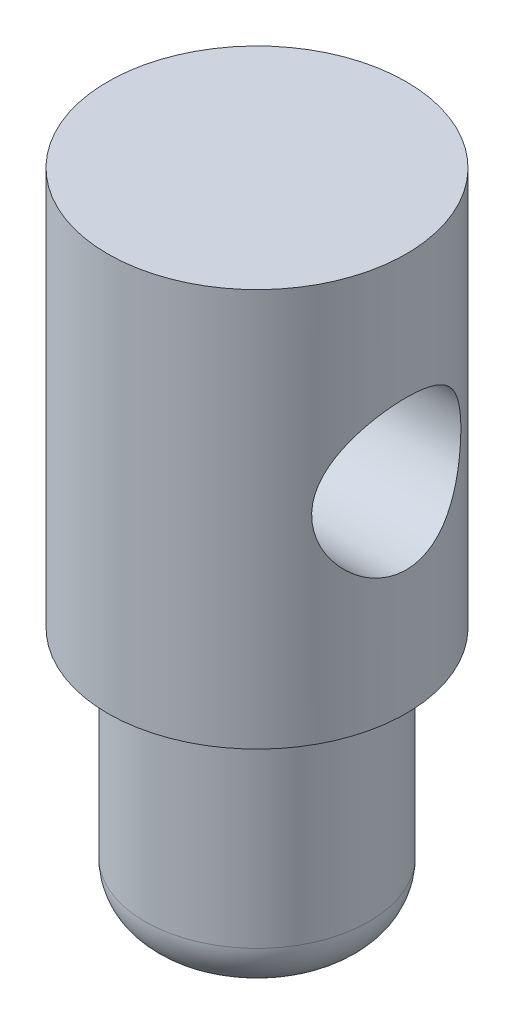
ISO-10303-21;
HEADER;
FILE_DESCRIPTION(('STEP AP214'),'2;1');
FILE_NAME('part.step','',(''),(''),'','','');
FILE_SCHEMA(('AUTOMOTIVE_DESIGN { 1 0 10303 214 1 1 1 1 }'));
ENDSEC;
DATA;
#1=APPLICATION_CONTEXT('core data for automotive mechanical design processes');
#2=APPLICATION_PROTOCOL_DEFINITION('international standard','automotive_design',2000,#1);
#3=PRODUCT_CONTEXT('',#1,'mechanical');
#4=PRODUCT('Part','Part','',(#3));
#5=PRODUCT_RELATED_PRODUCT_CATEGORY('part','',(#4));
#6=PRODUCT_DEFINITION_FORMATION('','',#4);
#7=PRODUCT_DEFINITION_CONTEXT('part definition',#1,'design');
#8=PRODUCT_DEFINITION('design','',#6,#7);
#9=PRODUCT_DEFINITION_SHAPE('','',#8);
#10=(LENGTH_UNIT() NAMED_UNIT(*) SI_UNIT(.MILLI.,.METRE.));
#11=(NAMED_UNIT(*) PLANE_ANGLE_UNIT() SI_UNIT($,.RADIAN.));
#12=(NAMED_UNIT(*) SI_UNIT($,.STERADIAN.) SOLID_ANGLE_UNIT());
#13=UNCERTAINTY_MEASURE_WITH_UNIT(LENGTH_MEASURE(1.E-05),#10,'distance_accuracy_value','');
#14=(GEOMETRIC_REPRESENTATION_CONTEXT(3) GLOBAL_UNCERTAINTY_ASSIGNED_CONTEXT((#13)) GLOBAL_UNIT_ASSIGNED_CONTEXT((#10,
#11,#12)) REPRESENTATION_CONTEXT('',''));
#15=CARTESIAN_POINT('',(0.,0.,0.));
#16=DIRECTION('',(0.,0.,1.));
#17=DIRECTION('',(1.,0.,0.));
#18=AXIS2_PLACEMENT_3D('',#15,#16,#17);
#19=CARTESIAN_POINT('',(0.,8.,0.));
#20=DIRECTION('',(0.,1.,0.));
#21=DIRECTION('',(0.,0.,1.));
#22=AXIS2_PLACEMENT_3D('',#19,#20,#21);
#23=PLANE('',#22);
#24=CARTESIAN_POINT('',(0.,8.,0.));
#25=DIRECTION('',(0.,1.,0.));
#26=DIRECTION('',(0.,0.,1.));
#27=AXIS2_PLACEMENT_3D('',#24,#25,#26);
#28=CIRCLE('',#27,3.);
#29=CARTESIAN_POINT('',(0.,8.,3.));
#30=VERTEX_POINT('',#29);
#31=EDGE_CURVE('E91',#30,#30,#28,.T.);
#32=ORIENTED_EDGE('',*,*,#31,.T.);
#33=EDGE_LOOP('',(#32));
#34=FACE_BOUND('',#33,.T.);
#35=ADVANCED_FACE('F35',(#34),#23,.T.);
#36=CARTESIAN_POINT('',(0.,2.,0.));
#37=DIRECTION('',(0.,-1.,0.));
#38=DIRECTION('',(0.,0.,-1.));
#39=AXIS2_PLACEMENT_3D('',#36,#37,#38);
#40=CYLINDRICAL_SURFACE('',#39,3.);
#41=CARTESIAN_POINT('',(-3.,2.5,0.));
#42=CARTESIAN_POINT('',(-2.99999570107562,2.50000495347579,-0.0788579444268502));
#43=CARTESIAN_POINT('',(-2.99685736529635,2.50625510968158,-0.157809899546344));
#44=CARTESIAN_POINT('',(-2.98461234055736,2.53097932051231,-0.313380352903344));
#45=CARTESIAN_POINT('',(-2.97549431743379,2.54947658949672,-0.389994130070444));
#46=CARTESIAN_POINT('',(-2.95224419105063,2.59779071292494,-0.538400317320673));
#47=CARTESIAN_POINT('',(-2.93813158766306,2.62756357637195,-0.61021020440872));
#48=CARTESIAN_POINT('',(-2.90618664773642,2.69735593204748,-0.747708925209898));
#49=CARTESIAN_POINT('',(-2.88835460450288,2.7373746163733,-0.813398240985089));
#50=CARTESIAN_POINT('',(-2.84934387387093,2.82927587422793,-0.941261726642864));
#51=CARTESIAN_POINT('',(-2.82802798691306,2.88172971885946,-1.00298281668316));
#52=CARTESIAN_POINT('',(-2.78489955370115,2.99578221887055,-1.11716916730047));
#53=CARTESIAN_POINT('',(-2.76308664313552,3.05738777765866,-1.16962737466015));
#54=CARTESIAN_POINT('',(-2.71948426796021,3.19372502428507,-1.26787800067542));
#55=CARTESIAN_POINT('',(-2.69782780455198,3.26910414751887,-1.31283800332746));
#56=CARTESIAN_POINT('',(-2.65928968158481,3.42755100397932,-1.38925234033604));
#57=CARTESIAN_POINT('',(-2.64240461410484,3.51061319308412,-1.4207163224495));
#58=CARTESIAN_POINT('',(-2.61686800556713,3.67699765813288,-1.46719866328288));
#59=CARTESIAN_POINT('',(-2.6077840737557,3.76000667810109,-1.48308878562066));
#60=CARTESIAN_POINT('',(-2.59772834922792,3.92796825666922,-1.50064048996327));
#61=CARTESIAN_POINT('',(-2.59674854014932,4.01291881130673,-1.50231613255961));
#62=CARTESIAN_POINT('',(-2.60266395385873,4.17142903647305,-1.49203093075844));
#63=CARTESIAN_POINT('',(-2.6086314549302,4.24513604683457,-1.48167683930523));
#64=CARTESIAN_POINT('',(-2.62614343100775,4.38958286405956,-1.4504097735854));
#65=CARTESIAN_POINT('',(-2.63768968247664,4.46032171795797,-1.42949343584648));
#66=CARTESIAN_POINT('',(-2.66531214619112,4.59884369884849,-1.37731467057901));
#67=CARTESIAN_POINT('',(-2.68148760995998,4.66651959817868,-1.34582260067399));
#68=CARTESIAN_POINT('',(-2.71655106422106,4.79595143888501,-1.273562531502));
#69=CARTESIAN_POINT('',(-2.73544027170286,4.85770470340013,-1.2327903657187));
#70=CARTESIAN_POINT('',(-2.77669736854929,4.98178187911484,-1.13709908236918));
#71=CARTESIAN_POINT('',(-2.79920265355119,5.04318531036424,-1.08104168755392));
#72=CARTESIAN_POINT('',(-2.84321434950611,5.15610312788635,-0.95933336811206));
#73=CARTESIAN_POINT('',(-2.86472027938201,5.20761278805083,-0.893677884861428));
#74=CARTESIAN_POINT('',(-2.90552980924446,5.30152849154459,-0.750774758747772));
#75=CARTESIAN_POINT('',(-2.92468476243011,5.34340070866861,-0.673130387399113));
#76=CARTESIAN_POINT('',(-2.95736821681863,5.41314554356452,-0.510699323233194));
#77=CARTESIAN_POINT('',(-2.9709011841533,5.44102927752275,-0.425918364397913));
#78=CARTESIAN_POINT('',(-2.98986500612153,5.47971310557501,-0.259149737491053));
#79=CARTESIAN_POINT('',(-2.99587407451965,5.49173685362017,-0.177512295822489));
#80=CARTESIAN_POINT('',(-3.00109520188655,5.50219709670173,-0.0131693999240275));
#81=CARTESIAN_POINT('',(-3.00031048081978,5.5006400284592,0.0695355298048631));
#82=CARTESIAN_POINT('',(-2.99236788380152,5.48468996737189,0.22684945797898));
#83=CARTESIAN_POINT('',(-2.98570868532252,5.47130120090501,0.301589112074895));
#84=CARTESIAN_POINT('',(-2.9673325697226,5.43364289215732,0.447610338452912));
#85=CARTESIAN_POINT('',(-2.95561509501618,5.40937215031976,0.518891528536631));
#86=CARTESIAN_POINT('',(-2.92776377120382,5.35000230035045,0.65833291267436));
#87=CARTESIAN_POINT('',(-2.91151322654446,5.31461342482557,0.726345595508705));
#88=CARTESIAN_POINT('',(-2.87615961476126,5.23433869653015,0.855692042548908));
#89=CARTESIAN_POINT('',(-2.85705533350407,5.18944879810691,0.917022944664888));
#90=CARTESIAN_POINT('',(-2.81562332004297,5.08635936200393,1.03765153393382));
#91=CARTESIAN_POINT('',(-2.79316327265249,5.02728569733228,1.09615811672854));
#92=CARTESIAN_POINT('',(-2.7489358741323,4.90011227308341,1.20278448167828));
#93=CARTESIAN_POINT('',(-2.72716901100071,4.83200632172812,1.25089707856781));
#94=CARTESIAN_POINT('',(-2.68576788309734,4.68453451874054,1.33756187171853));
#95=CARTESIAN_POINT('',(-2.66628794383591,4.60478310085828,1.37553824370037));
#96=CARTESIAN_POINT('',(-2.63361108441202,4.43873489863755,1.43712423890206));
#97=CARTESIAN_POINT('',(-2.62040607332625,4.35244671029966,1.46075237380053));
#98=CARTESIAN_POINT('',(-2.60342251538703,4.18463466567294,1.49079253120031));
#99=CARTESIAN_POINT('',(-2.59886075197597,4.10344861984714,1.49863949460818));
#100=CARTESIAN_POINT('',(-2.59748031962405,3.94082939925321,1.5010337315643));
#101=CARTESIAN_POINT('',(-2.60065829439585,3.85939634689321,1.49558676993486));
#102=CARTESIAN_POINT('',(-2.61356793076615,3.70677474769984,1.47288918838996));
#103=CARTESIAN_POINT('',(-2.62264641723988,3.63534929478289,1.45681247151455));
#104=CARTESIAN_POINT('',(-2.64556524281479,3.49628782086345,1.41476303733662));
#105=CARTESIAN_POINT('',(-2.65940711354503,3.42865302686195,1.38878713673988));
#106=CARTESIAN_POINT('',(-2.69142795546803,3.2940627235202,1.32572361795085));
#107=CARTESIAN_POINT('',(-2.70983583593881,3.22745814725646,1.28800670672355));
#108=CARTESIAN_POINT('',(-2.74852997452291,3.10108819572811,1.20322645745609));
#109=CARTESIAN_POINT('',(-2.76881720693416,3.04132640421833,1.15615825686234));
#110=CARTESIAN_POINT('',(-2.81193484737138,2.92278702646799,1.04730498999206));
#111=CARTESIAN_POINT('',(-2.83477474959942,2.86501134647456,0.984426634495893));
#112=CARTESIAN_POINT('',(-2.87816628389896,2.7606055248471,0.849232209349797));
#113=CARTESIAN_POINT('',(-2.89871667939293,2.71398139079514,0.776911084957797));
#114=CARTESIAN_POINT('',(-2.93547014349806,2.63314545593189,0.623897395174419));
#115=CARTESIAN_POINT('',(-2.95164144740899,2.5990237461453,0.543149255665096));
#116=CARTESIAN_POINT('',(-2.9775201194848,2.54528774836389,0.37611315170713));
#117=CARTESIAN_POINT('',(-2.98724585044602,2.52563222979143,0.28984169938365));
#118=CARTESIAN_POINT('',(-2.99543192870217,2.50915388337139,0.168902919736343));
#119=CARTESIAN_POINT('',(-2.99714048010376,2.50572603870049,0.135242819162348));
#120=CARTESIAN_POINT('',(-2.99942545465223,2.50114800172887,0.0677275977076379));
#121=CARTESIAN_POINT('',(-3.00000184655071,2.49999787229469,0.0338724714699429));
#122=CARTESIAN_POINT('',(-3.,2.5,0.));
#123=B_SPLINE_CURVE_WITH_KNOTS('',3,(#41,#42,#43,#44,#45,#46,#47,#48,#49,#50,#51,#52,#53,#54,
#55,#56,#57,#58,#59,#60,#61,#62,#63,#64,#65,#66,#67,#68,#69,#70,#71,#72,#73,#74,#75,#76,#77,#78,
#79,#80,#81,#82,#83,#84,#85,#86,#87,#88,#89,#90,#91,#92,#93,#94,#95,#96,#97,#98,#99,#100,#101,
#102,#103,#104,#105,#106,#107,#108,#109,#110,#111,#112,#113,#114,#115,#116,#117,#118,#119,#120,
#121,#122),.UNSPECIFIED.,.T.,.F.,(4,2,2,2,2,2,2,2,2,2,2,2,2,2,2,2,2,2,2,2,2,2,2,2,2,2,2,2,2,2,2,
2,2,2,2,2,2,2,2,2,4),(0.,0.236436386130439,0.473322224563797,0.709293233238448,
0.945245640872352,1.19547263807713,1.44588935648105,1.71572589646129,1.98536921847421,
2.23887018210344,2.49212035993531,2.71508568613981,2.93812205888518,3.16635360252731,
3.39468781890333,3.65197412000818,3.9093830189803,4.17874533321661,4.4478932536842,
4.69474935707019,4.94148846767214,5.16910359759183,5.39674382446398,5.63089284041848,
5.86514176122509,6.12239415966628,6.37982382923148,6.64972023242589,6.91926767918177,
7.1629396125457,7.40650589797018,7.62686895373284,7.84730293182527,8.08254685170431,
8.31791341715446,8.58187864135758,8.84598575071869,9.11196020495291,9.37717362931724,
9.47872920200876,9.580287577666),.UNSPECIFIED.);
#124=CARTESIAN_POINT('',(-3.,2.5,0.));
#125=VERTEX_POINT('',#124);
#126=EDGE_CURVE('E46',#125,#125,#123,.T.);
#127=ORIENTED_EDGE('',*,*,#126,.T.);
#128=EDGE_LOOP('',(#127));
#129=FACE_BOUND('',#128,.T.);
#130=CARTESIAN_POINT('',(2.59807621135332,4.,-1.5));
#131=CARTESIAN_POINT('',(2.59808302092689,3.92183828770712,-1.4999945446118));
#132=CARTESIAN_POINT('',(2.60165701781635,3.84357788271243,-1.49384995609983));
#133=CARTESIAN_POINT('',(2.61543549678079,3.68945910298427,-1.46958481484708));
#134=CARTESIAN_POINT('',(2.62565391083339,3.61360612743489,-1.45143909683127));
#135=CARTESIAN_POINT('',(2.65124019908098,3.46682250348409,-1.40414992304972));
#136=CARTESIAN_POINT('',(2.66658065209878,3.39586802128962,-1.3750649287406));
#137=CARTESIAN_POINT('',(2.70063997225287,3.25986369700492,-1.30690128806456));
#138=CARTESIAN_POINT('',(2.71935902214097,3.19481417460631,-1.26782210105366));
#139=CARTESIAN_POINT('',(2.75995303586162,3.06654140716374,-1.17699981079632));
#140=CARTESIAN_POINT('',(2.7819609545693,3.00391129648968,-1.12447805421566));
#141=CARTESIAN_POINT('',(2.82557974178559,2.88788741738994,-1.0098807114217));
#142=CARTESIAN_POINT('',(2.84719040746875,2.83449825612472,-0.947800388673441));
#143=CARTESIAN_POINT('',(2.88932215429424,2.73494927327851,-0.81073434512182));
#144=CARTESIAN_POINT('',(2.90967159627259,2.6895193482107,-0.735160783518863));
#145=CARTESIAN_POINT('',(2.94526134149293,2.61228872013136,-0.576235539899257));
#146=CARTESIAN_POINT('',(2.96050486775612,2.58047941579424,-0.492888807207234));
#147=CARTESIAN_POINT('',(2.98320691866356,2.53374300804835,-0.327067415888966));
#148=CARTESIAN_POINT('',(2.99114220331338,2.5177757104667,-0.244952685733227));
#149=CARTESIAN_POINT('',(3.00011375769101,2.49975082198744,-0.0788559430467729));
#150=CARTESIAN_POINT('',(3.00115420176885,2.49768481480643,0.00512490876560709));
#151=CARTESIAN_POINT('',(2.99644472874675,2.50712001095552,0.164748786635624));
#152=CARTESIAN_POINT('',(2.99127743838241,2.51745702328183,0.240481798765187));
#153=CARTESIAN_POINT('',(2.97561367889621,2.54932126585699,0.388970657877483));
#154=CARTESIAN_POINT('',(2.96511681099591,2.57084933346433,0.461726281640888));
#155=CARTESIAN_POINT('',(2.93957374931482,2.62462384913472,0.60346408735433));
#156=CARTESIAN_POINT('',(2.92446662293799,2.6570144697581,0.672380135272768));
#157=CARTESIAN_POINT('',(2.89106468980031,2.73139512430224,0.803965202269993));
#158=CARTESIAN_POINT('',(2.87276874236226,2.77338859495352,0.866631973257968));
#159=CARTESIAN_POINT('',(2.83266591598844,2.87034302729952,0.990260491347292));
#160=CARTESIAN_POINT('',(2.81069063997263,2.92615454248901,1.05050111254404));
#161=CARTESIAN_POINT('',(2.76681510880218,3.04688458739526,1.16115655544667));
#162=CARTESIAN_POINT('',(2.74491492398443,3.11181005841109,1.21156381736135));
#163=CARTESIAN_POINT('',(2.70216234138727,3.25397228863613,1.30425800196332));
#164=CARTESIAN_POINT('',(2.68146479986061,3.33172903458132,1.34582597246708));
#165=CARTESIAN_POINT('',(2.64563175417864,3.4944065070385,1.41497866950185));
#166=CARTESIAN_POINT('',(2.63049045069101,3.57931964952634,1.44257798731634));
#167=CARTESIAN_POINT('',(2.60916953725552,3.74682176692419,1.48077031653756));
#168=CARTESIAN_POINT('',(2.60237483772745,3.82906167856533,1.49253768317996));
#169=CARTESIAN_POINT('',(2.59676879042414,3.99460201227481,1.50227541991714));
#170=CARTESIAN_POINT('',(2.59795180333967,4.07790164367968,1.50025553597254));
#171=CARTESIAN_POINT('',(2.60751504810877,4.23348087786809,1.48355406501595));
#172=CARTESIAN_POINT('',(2.61509381259981,4.30596917666189,1.4702817250687));
#173=CARTESIAN_POINT('',(2.63541032327012,4.44755167940644,1.43354442694866));
#174=CARTESIAN_POINT('',(2.64814974007551,4.51664477611991,1.41007616793542));
#175=CARTESIAN_POINT('',(2.67804333119485,4.65311699635404,1.35247138290733));
#176=CARTESIAN_POINT('',(2.69537464864595,4.72026852528033,1.31789109553909));
#177=CARTESIAN_POINT('',(2.73234179245875,4.84820390730849,1.23943059602371));
#178=CARTESIAN_POINT('',(2.75197880032721,4.90898446526993,1.19554560649833));
#179=CARTESIAN_POINT('',(2.79431997684504,5.03046815128532,1.09325575079828));
#180=CARTESIAN_POINT('',(2.81709874731433,5.09019572607649,1.03371790847245));
#181=CARTESIAN_POINT('',(2.86101352466839,5.19911835699039,0.905106743097433));
#182=CARTESIAN_POINT('',(2.88214897511564,5.24830985534581,0.836030211983021));
#183=CARTESIAN_POINT('',(2.92112042536435,5.33586058892515,0.687803043838136));
#184=CARTESIAN_POINT('',(2.93885462508044,5.37389967731637,0.60843464636117));
#185=CARTESIAN_POINT('',(2.96825032438951,5.43570685578609,0.443283546961623));
#186=CARTESIAN_POINT('',(2.9799171551456,5.45948747704946,0.357506552088264));
#187=CARTESIAN_POINT('',(2.99501262272824,5.49005284626199,0.190469523495626));
#188=CARTESIAN_POINT('',(2.99909891862287,5.49819681381417,0.109517165775686));
#189=CARTESIAN_POINT('',(3.00063195562697,5.5012648981816,-0.0526889789268053));
#190=CARTESIAN_POINT('',(2.99808102100335,5.49619364278535,-0.13394265044263));
#191=CARTESIAN_POINT('',(2.98700953256884,5.47387538980656,-0.288806988475721));
#192=CARTESIAN_POINT('',(2.97889342001985,5.45745272611349,-0.362568476716896));
#193=CARTESIAN_POINT('',(2.95788140495135,5.41400950104554,-0.506168928275426));
#194=CARTESIAN_POINT('',(2.94498481699194,5.38698741985982,-0.576007327433263));
#195=CARTESIAN_POINT('',(2.9148889612218,5.32190942175104,-0.713135109367327));
#196=CARTESIAN_POINT('',(2.89752925798199,5.28343101518824,-0.78018771405007));
#197=CARTESIAN_POINT('',(2.86032199712739,5.19706310371143,-0.907161962721038));
#198=CARTESIAN_POINT('',(2.84047329837541,5.14916927632649,-0.967080311122361));
#199=CARTESIAN_POINT('',(2.79792915339941,5.03980429146595,-1.08437100623534));
#200=CARTESIAN_POINT('',(2.77514698517547,4.97745626878421,-1.14089652680891));
#201=CARTESIAN_POINT('',(2.73094614244278,4.84382391830535,-1.24299493109201));
#202=CARTESIAN_POINT('',(2.70952868642798,4.77253176869847,-1.28855812501509));
#203=CARTESIAN_POINT('',(2.66999407957374,4.62004503012857,-1.36864661967848));
#204=CARTESIAN_POINT('',(2.65200261384405,4.5386087033069,-1.40277759894141));
#205=CARTESIAN_POINT('',(2.62299234492527,4.37000139349033,-1.45631806425962));
#206=CARTESIAN_POINT('',(2.61195024221553,4.28285066663097,-1.47577678676302));
#207=CARTESIAN_POINT('',(2.60293908902686,4.16229196652201,-1.49155051179662));
#208=CARTESIAN_POINT('',(2.60112193507728,4.12994815840318,-1.49471415744578));
#209=CARTESIAN_POINT('',(2.59868903831625,4.06507527897664,-1.49894010763495));
#210=CARTESIAN_POINT('',(2.59807337587664,4.03254619542119,-1.50000227159981));
#211=CARTESIAN_POINT('',(2.59807621135332,4.,-1.5));
#212=B_SPLINE_CURVE_WITH_KNOTS('',3,(#130,#131,#132,#133,#134,#135,#136,#137,#138,#139,#140,
#141,#142,#143,#144,#145,#146,#147,#148,#149,#150,#151,#152,#153,#154,#155,#156,#157,#158,#159,
#160,#161,#162,#163,#164,#165,#166,#167,#168,#169,#170,#171,#172,#173,#174,#175,#176,#177,#178,
#179,#180,#181,#182,#183,#184,#185,#186,#187,#188,#189,#190,#191,#192,#193,#194,#195,#196,#197,
#198,#199,#200,#201,#202,#203,#204,#205,#206,#207,#208,#209,#210,#211),.UNSPECIFIED.,.T.,.F.,(4,
2,2,2,2,2,2,2,2,2,2,2,2,2,2,2,2,2,2,2,2,2,2,2,2,2,2,2,2,2,2,2,2,2,2,2,2,2,2,2,4),(0.,
0.234348183892073,0.469189339237207,0.702792893878329,0.936409088167724,1.18929346874735,
1.44230356626556,1.71236838358145,1.98226240445837,2.23295227451903,2.4834903552906,
2.71224146226808,2.94100968776183,3.1729430209672,3.40495949025408,3.65890787185336,
3.91305072368878,4.18333262594173,4.45333161317557,4.70193436281318,4.9503613978256,
5.17161275136038,5.39293578654095,5.62450944609132,5.85620229330071,6.1171011537092,
6.37808797467303,6.64596272119449,6.91360169713158,7.1566840558423,7.39968130190958,
7.62666637307239,7.8536840026802,8.09041126079208,8.32724745151079,8.58765362775101,
8.84828914267732,9.11716123557908,9.38512699504141,9.48270202777964,9.58028358741811),.UNSPECIFIED.);
#213=CARTESIAN_POINT('',(2.59807621135332,4.,-1.5));
#214=VERTEX_POINT('',#213);
#215=EDGE_CURVE('E50',#214,#214,#212,.T.);
#216=ORIENTED_EDGE('',*,*,#215,.T.);
#217=EDGE_LOOP('',(#216));
#218=FACE_BOUND('',#217,.T.);
#219=CARTESIAN_POINT('',(0.,0.,0.));
#220=DIRECTION('',(0.,1.,0.));
#221=DIRECTION('',(0.,0.,1.));
#222=AXIS2_PLACEMENT_3D('',#219,#220,#221);
#223=CIRCLE('',#222,3.);
#224=CARTESIAN_POINT('',(0.,0.,3.));
#225=VERTEX_POINT('',#224);
#226=EDGE_CURVE('E89',#225,#225,#223,.T.);
#227=ORIENTED_EDGE('',*,*,#226,.T.);
#228=EDGE_LOOP('',(#227));
#229=FACE_BOUND('',#228,.T.);
#230=ORIENTED_EDGE('',*,*,#31,.F.);
#231=EDGE_LOOP('',(#230));
#232=FACE_BOUND('',#231,.T.);
#233=ADVANCED_FACE('F59',(#129,#218,#229,#232),#40,.T.);
#234=CARTESIAN_POINT('',(0.,0.,0.));
#235=DIRECTION('',(0.,1.,0.));
#236=DIRECTION('',(0.,0.,1.));
#237=AXIS2_PLACEMENT_3D('',#234,#235,#236);
#238=PLANE('',#237);
#239=CARTESIAN_POINT('',(0.,0.,0.));
#240=DIRECTION('',(0.,1.,0.));
#241=DIRECTION('',(0.,0.,1.));
#242=AXIS2_PLACEMENT_3D('',#239,#240,#241);
#243=CIRCLE('',#242,2.25);
#244=CARTESIAN_POINT('',(0.,0.,2.25));
#245=VERTEX_POINT('',#244);
#246=EDGE_CURVE('E86',#245,#245,#243,.T.);
#247=ORIENTED_EDGE('',*,*,#246,.T.);
#248=EDGE_LOOP('',(#247));
#249=FACE_BOUND('',#248,.T.);
#250=ORIENTED_EDGE('',*,*,#226,.F.);
#251=EDGE_LOOP('',(#250));
#252=FACE_BOUND('',#251,.T.);
#253=ADVANCED_FACE('F74',(#249,#252),#238,.F.);
#254=CARTESIAN_POINT('',(0.,-5.,0.));
#255=DIRECTION('',(0.,1.,0.));
#256=DIRECTION('',(0.,0.,1.));
#257=AXIS2_PLACEMENT_3D('',#254,#255,#256);
#258=CYLINDRICAL_SURFACE('',#257,2.25);
#259=CARTESIAN_POINT('',(0.,-4.,0.));
#260=DIRECTION('',(0.,1.,0.));
#261=DIRECTION('',(0.,0.,1.));
#262=AXIS2_PLACEMENT_3D('',#259,#260,#261);
#263=CIRCLE('',#262,2.25);
#264=CARTESIAN_POINT('',(0.,-4.,2.25));
#265=VERTEX_POINT('',#264);
#266=EDGE_CURVE('E42',#265,#265,#263,.T.);
#267=ORIENTED_EDGE('',*,*,#266,.T.);
#268=EDGE_LOOP('',(#267));
#269=FACE_BOUND('',#268,.T.);
#270=ORIENTED_EDGE('',*,*,#246,.F.);
#271=EDGE_LOOP('',(#270));
#272=FACE_BOUND('',#271,.T.);
#273=ADVANCED_FACE('F71',(#269,#272),#258,.T.);
#274=CARTESIAN_POINT('',(0.,-5.,0.));
#275=DIRECTION('',(0.,1.,0.));
#276=DIRECTION('',(0.,0.,1.));
#277=AXIS2_PLACEMENT_3D('',#274,#275,#276);
#278=PLANE('',#277);
#279=CARTESIAN_POINT('',(0.,-5.,0.));
#280=DIRECTION('',(0.,1.,0.));
#281=DIRECTION('',(0.,0.,1.));
#282=AXIS2_PLACEMENT_3D('',#279,#280,#281);
#283=CIRCLE('',#282,1.25);
#284=CARTESIAN_POINT('',(0.,-5.,1.25));
#285=VERTEX_POINT('',#284);
#286=EDGE_CURVE('E10',#285,#285,#283,.F.);
#287=ORIENTED_EDGE('',*,*,#286,.T.);
#288=EDGE_LOOP('',(#287));
#289=FACE_BOUND('',#288,.T.);
#290=ADVANCED_FACE('F66',(#289),#278,.F.);
#291=CARTESIAN_POINT('',(-3.,4.,0.));
#292=DIRECTION('',(1.,0.,0.));
#293=DIRECTION('',(0.,0.,-1.));
#294=AXIS2_PLACEMENT_3D('',#291,#292,#293);
#295=CYLINDRICAL_SURFACE('',#294,1.5);
#296=ORIENTED_EDGE('',*,*,#215,.F.);
#297=EDGE_LOOP('',(#296));
#298=FACE_BOUND('',#297,.T.);
#299=ORIENTED_EDGE('',*,*,#126,.F.);
#300=EDGE_LOOP('',(#299));
#301=FACE_BOUND('',#300,.T.);
#302=ADVANCED_FACE('F62',(#298,#301),#295,.F.);
#303=CARTESIAN_POINT('',(0.,-4.,0.));
#304=DIRECTION('',(0.,1.,0.));
#305=DIRECTION('',(0.,0.,1.));
#306=AXIS2_PLACEMENT_3D('',#303,#304,#305);
#307=TOROIDAL_SURFACE('',#306,1.25,1.);
#308=ORIENTED_EDGE('',*,*,#286,.F.);
#309=EDGE_LOOP('',(#308));
#310=FACE_BOUND('',#309,.T.);
#311=ORIENTED_EDGE('',*,*,#266,.F.);
#312=EDGE_LOOP('',(#311));
#313=FACE_BOUND('',#312,.T.);
#314=ADVANCED_FACE('F37',(#310,#313),#307,.T.);
#315=CLOSED_SHELL('',(#35,#233,#253,#273,#290,#302,#314));
#316=MANIFOLD_SOLID_BREP('B2',#315);
#317=ADVANCED_BREP_SHAPE_REPRESENTATION('',(#18,#316),#14);
#318=SHAPE_DEFINITION_REPRESENTATION(#9,#317);
ENDSEC;
END-ISO-10303-21;
